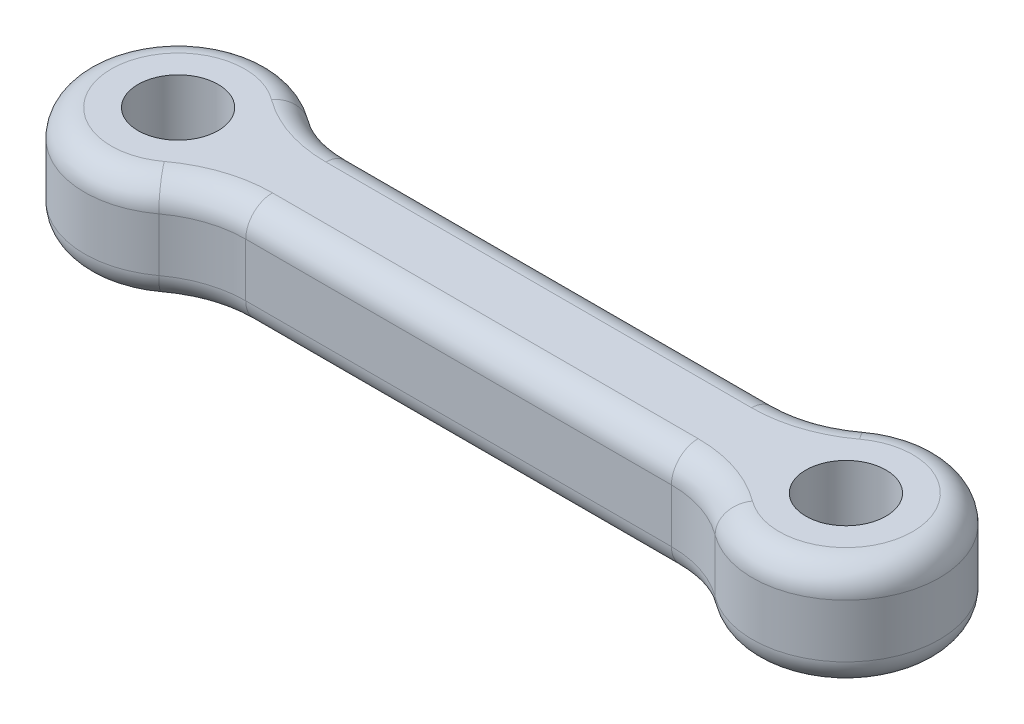
ISO-10303-21;
HEADER;
FILE_DESCRIPTION(('STEP AP214'),'2;1');
FILE_NAME('part.step','',(''),(''),'','','');
FILE_SCHEMA(('AUTOMOTIVE_DESIGN { 1 0 10303 214 1 1 1 1 }'));
ENDSEC;
DATA;
#1=APPLICATION_CONTEXT('core data for automotive mechanical design processes');
#2=APPLICATION_PROTOCOL_DEFINITION('international standard','automotive_design',2000,#1);
#3=PRODUCT_CONTEXT('',#1,'mechanical');
#4=PRODUCT('Part','Part','',(#3));
#5=PRODUCT_RELATED_PRODUCT_CATEGORY('part','',(#4));
#6=PRODUCT_DEFINITION_FORMATION('','',#4);
#7=PRODUCT_DEFINITION_CONTEXT('part definition',#1,'design');
#8=PRODUCT_DEFINITION('design','',#6,#7);
#9=PRODUCT_DEFINITION_SHAPE('','',#8);
#10=(LENGTH_UNIT() NAMED_UNIT(*) SI_UNIT(.MILLI.,.METRE.));
#11=(NAMED_UNIT(*) PLANE_ANGLE_UNIT() SI_UNIT($,.RADIAN.));
#12=(NAMED_UNIT(*) SI_UNIT($,.STERADIAN.) SOLID_ANGLE_UNIT());
#13=UNCERTAINTY_MEASURE_WITH_UNIT(LENGTH_MEASURE(1.E-05),#10,'distance_accuracy_value','');
#14=(GEOMETRIC_REPRESENTATION_CONTEXT(3) GLOBAL_UNCERTAINTY_ASSIGNED_CONTEXT((#13)) GLOBAL_UNIT_ASSIGNED_CONTEXT((#10,
#11,#12)) REPRESENTATION_CONTEXT('',''));
#15=CARTESIAN_POINT('',(0.,0.,0.));
#16=DIRECTION('',(0.,0.,1.));
#17=DIRECTION('',(1.,0.,0.));
#18=AXIS2_PLACEMENT_3D('',#15,#16,#17);
#19=CARTESIAN_POINT('',(4.53284898455871,4.,6.09890663893832));
#20=DIRECTION('',(0.,-1.,0.));
#21=DIRECTION('',(0.,0.,-1.));
#22=AXIS2_PLACEMENT_3D('',#19,#20,#21);
#23=PLANE('',#22);
#24=CARTESIAN_POINT('',(0.,4.,0.));
#25=DIRECTION('',(0.,-1.,0.));
#26=DIRECTION('',(0.,0.,-1.));
#27=AXIS2_PLACEMENT_3D('',#24,#25,#26);
#28=CIRCLE('',#27,2.5);
#29=CARTESIAN_POINT('',(1.49128328585177,4.,-2.00650795197506));
#30=VERTEX_POINT('',#29);
#31=CARTESIAN_POINT('',(1.49128328585177,4.,2.00650795197506));
#32=VERTEX_POINT('',#31);
#33=EDGE_CURVE('E174',#30,#32,#28,.F.);
#34=ORIENTED_EDGE('',*,*,#33,.T.);
#35=CARTESIAN_POINT('',(4.53284898455871,4.,6.09890663893832));
#36=DIRECTION('',(0.,-1.,0.));
#37=DIRECTION('',(0.,0.,-1.));
#38=AXIS2_PLACEMENT_3D('',#35,#36,#37);
#39=CIRCLE('',#38,5.09890663893832);
#40=CARTESIAN_POINT('',(4.53284898455871,4.,1.));
#41=VERTEX_POINT('',#40);
#42=EDGE_CURVE('E155',#32,#41,#39,.T.);
#43=ORIENTED_EDGE('',*,*,#42,.T.);
#44=DIRECTION('',(1.,0.,0.));
#45=VECTOR('',#44,1.);
#46=CARTESIAN_POINT('',(4.53284898455871,4.,1.));
#47=LINE('',#46,#45);
#48=CARTESIAN_POINT('',(20.4671510154413,4.,0.999999999999997));
#49=VERTEX_POINT('',#48);
#50=EDGE_CURVE('E163',#41,#49,#47,.T.);
#51=ORIENTED_EDGE('',*,*,#50,.T.);
#52=CARTESIAN_POINT('',(20.4671510154413,4.,6.09890663893832));
#53=DIRECTION('',(0.,-1.,0.));
#54=DIRECTION('',(0.,0.,-1.));
#55=AXIS2_PLACEMENT_3D('',#52,#53,#54);
#56=CIRCLE('',#55,5.09890663893832);
#57=CARTESIAN_POINT('',(23.5087167141482,4.,2.00650795197506));
#58=VERTEX_POINT('',#57);
#59=EDGE_CURVE('E169',#49,#58,#56,.T.);
#60=ORIENTED_EDGE('',*,*,#59,.T.);
#61=CARTESIAN_POINT('',(25.,4.,0.));
#62=DIRECTION('',(0.,-1.,0.));
#63=DIRECTION('',(0.,0.,-1.));
#64=AXIS2_PLACEMENT_3D('',#61,#62,#63);
#65=CIRCLE('',#64,2.5);
#66=CARTESIAN_POINT('',(23.5087167141482,4.,-2.00650795197506));
#67=VERTEX_POINT('',#66);
#68=EDGE_CURVE('E320',#58,#67,#65,.F.);
#69=ORIENTED_EDGE('',*,*,#68,.T.);
#70=CARTESIAN_POINT('',(20.4671510154413,4.,-6.09890663893832));
#71=DIRECTION('',(0.,-1.,0.));
#72=DIRECTION('',(0.,0.,-1.));
#73=AXIS2_PLACEMENT_3D('',#70,#71,#72);
#74=CIRCLE('',#73,5.09890663893832);
#75=CARTESIAN_POINT('',(20.4671510154413,4.,-1.));
#76=VERTEX_POINT('',#75);
#77=EDGE_CURVE('E322',#67,#76,#74,.T.);
#78=ORIENTED_EDGE('',*,*,#77,.T.);
#79=DIRECTION('',(-1.,0.,0.));
#80=VECTOR('',#79,1.);
#81=CARTESIAN_POINT('',(4.53284898455871,4.,-1.));
#82=LINE('',#81,#80);
#83=CARTESIAN_POINT('',(4.53284898455871,4.,-1.));
#84=VERTEX_POINT('',#83);
#85=EDGE_CURVE('E324',#76,#84,#82,.T.);
#86=ORIENTED_EDGE('',*,*,#85,.T.);
#87=CARTESIAN_POINT('',(4.53284898455871,4.,-6.09890663893832));
#88=DIRECTION('',(0.,-1.,0.));
#89=DIRECTION('',(0.,0.,-1.));
#90=AXIS2_PLACEMENT_3D('',#87,#88,#89);
#91=CIRCLE('',#90,5.09890663893832);
#92=EDGE_CURVE('E180',#84,#30,#91,.T.);
#93=ORIENTED_EDGE('',*,*,#92,.T.);
#94=EDGE_LOOP('',(#34,#43,#51,#60,#69,#78,#86,#93));
#95=FACE_BOUND('',#94,.T.);
#96=CARTESIAN_POINT('',(0.,4.,0.));
#97=DIRECTION('',(0.,1.,0.));
#98=DIRECTION('',(0.,0.,1.));
#99=AXIS2_PLACEMENT_3D('',#96,#97,#98);
#100=CIRCLE('',#99,1.5);
#101=CARTESIAN_POINT('',(0.,4.,1.5));
#102=VERTEX_POINT('',#101);
#103=EDGE_CURVE('E295',#102,#102,#100,.T.);
#104=ORIENTED_EDGE('',*,*,#103,.F.);
#105=EDGE_LOOP('',(#104));
#106=FACE_BOUND('',#105,.T.);
#107=CARTESIAN_POINT('',(25.,4.,0.));
#108=DIRECTION('',(0.,1.,0.));
#109=DIRECTION('',(0.,0.,-1.));
#110=AXIS2_PLACEMENT_3D('',#107,#108,#109);
#111=CIRCLE('',#110,1.5);
#112=CARTESIAN_POINT('',(25.,4.,-1.5));
#113=VERTEX_POINT('',#112);
#114=EDGE_CURVE('E611',#113,#113,#111,.T.);
#115=ORIENTED_EDGE('',*,*,#114,.F.);
#116=EDGE_LOOP('',(#115));
#117=FACE_BOUND('',#116,.T.);
#118=ADVANCED_FACE('F34',(#95,#106,#117),#23,.F.);
#119=CARTESIAN_POINT('',(4.53284898455871,0.,6.09890663893832));
#120=DIRECTION('',(0.,-1.,0.));
#121=DIRECTION('',(0.,0.,-1.));
#122=AXIS2_PLACEMENT_3D('',#119,#120,#121);
#123=PLANE('',#122);
#124=DIRECTION('',(1.,0.,0.));
#125=VECTOR('',#124,1.);
#126=CARTESIAN_POINT('',(4.53284898455871,0.,1.));
#127=LINE('',#126,#125);
#128=CARTESIAN_POINT('',(20.4671510154413,0.,0.999999999999997));
#129=VERTEX_POINT('',#128);
#130=CARTESIAN_POINT('',(4.53284898455871,0.,1.));
#131=VERTEX_POINT('',#130);
#132=EDGE_CURVE('E209',#129,#131,#127,.F.);
#133=ORIENTED_EDGE('',*,*,#132,.T.);
#134=CARTESIAN_POINT('',(4.53284898455871,0.,6.09890663893832));
#135=DIRECTION('',(0.,-1.,0.));
#136=DIRECTION('',(0.,0.,-1.));
#137=AXIS2_PLACEMENT_3D('',#134,#135,#136);
#138=CIRCLE('',#137,5.09890663893832);
#139=CARTESIAN_POINT('',(1.49128328585177,0.,2.00650795197506));
#140=VERTEX_POINT('',#139);
#141=EDGE_CURVE('E222',#131,#140,#138,.F.);
#142=ORIENTED_EDGE('',*,*,#141,.T.);
#143=CARTESIAN_POINT('',(0.,0.,0.));
#144=DIRECTION('',(0.,-1.,0.));
#145=DIRECTION('',(0.,0.,-1.));
#146=AXIS2_PLACEMENT_3D('',#143,#144,#145);
#147=CIRCLE('',#146,2.5);
#148=CARTESIAN_POINT('',(1.49128328585177,0.,-2.00650795197506));
#149=VERTEX_POINT('',#148);
#150=EDGE_CURVE('E58',#140,#149,#147,.T.);
#151=ORIENTED_EDGE('',*,*,#150,.T.);
#152=CARTESIAN_POINT('',(4.53284898455871,0.,-6.09890663893832));
#153=DIRECTION('',(0.,-1.,0.));
#154=DIRECTION('',(0.,0.,-1.));
#155=AXIS2_PLACEMENT_3D('',#152,#153,#154);
#156=CIRCLE('',#155,5.09890663893832);
#157=CARTESIAN_POINT('',(4.53284898455871,0.,-1.));
#158=VERTEX_POINT('',#157);
#159=EDGE_CURVE('E219',#149,#158,#156,.F.);
#160=ORIENTED_EDGE('',*,*,#159,.T.);
#161=DIRECTION('',(-1.,0.,0.));
#162=VECTOR('',#161,1.);
#163=CARTESIAN_POINT('',(20.4671510154413,0.,-1.));
#164=LINE('',#163,#162);
#165=CARTESIAN_POINT('',(20.4671510154413,0.,-1.));
#166=VERTEX_POINT('',#165);
#167=EDGE_CURVE('E217',#158,#166,#164,.F.);
#168=ORIENTED_EDGE('',*,*,#167,.T.);
#169=CARTESIAN_POINT('',(20.4671510154413,0.,-6.09890663893832));
#170=DIRECTION('',(0.,-1.,0.));
#171=DIRECTION('',(0.,0.,-1.));
#172=AXIS2_PLACEMENT_3D('',#169,#170,#171);
#173=CIRCLE('',#172,5.09890663893832);
#174=CARTESIAN_POINT('',(23.5087167141482,0.,-2.00650795197506));
#175=VERTEX_POINT('',#174);
#176=EDGE_CURVE('E215',#166,#175,#173,.F.);
#177=ORIENTED_EDGE('',*,*,#176,.T.);
#178=CARTESIAN_POINT('',(25.,0.,0.));
#179=DIRECTION('',(0.,-1.,0.));
#180=DIRECTION('',(0.,0.,-1.));
#181=AXIS2_PLACEMENT_3D('',#178,#179,#180);
#182=CIRCLE('',#181,2.5);
#183=CARTESIAN_POINT('',(23.5087167141482,0.,2.00650795197506));
#184=VERTEX_POINT('',#183);
#185=EDGE_CURVE('E213',#175,#184,#182,.T.);
#186=ORIENTED_EDGE('',*,*,#185,.T.);
#187=CARTESIAN_POINT('',(20.4671510154413,0.,6.09890663893832));
#188=DIRECTION('',(0.,-1.,0.));
#189=DIRECTION('',(0.,0.,-1.));
#190=AXIS2_PLACEMENT_3D('',#187,#188,#189);
#191=CIRCLE('',#190,5.09890663893832);
#192=EDGE_CURVE('E211',#184,#129,#191,.F.);
#193=ORIENTED_EDGE('',*,*,#192,.T.);
#194=EDGE_LOOP('',(#133,#142,#151,#160,#168,#177,#186,#193));
#195=FACE_BOUND('',#194,.T.);
#196=CARTESIAN_POINT('',(0.,0.,0.));
#197=DIRECTION('',(0.,1.,0.));
#198=DIRECTION('',(0.,0.,1.));
#199=AXIS2_PLACEMENT_3D('',#196,#197,#198);
#200=CIRCLE('',#199,1.5);
#201=CARTESIAN_POINT('',(0.,0.,1.5));
#202=VERTEX_POINT('',#201);
#203=EDGE_CURVE('E300',#202,#202,#200,.T.);
#204=ORIENTED_EDGE('',*,*,#203,.T.);
#205=EDGE_LOOP('',(#204));
#206=FACE_BOUND('',#205,.T.);
#207=CARTESIAN_POINT('',(25.,0.,0.));
#208=DIRECTION('',(0.,1.,0.));
#209=DIRECTION('',(0.,0.,-1.));
#210=AXIS2_PLACEMENT_3D('',#207,#208,#209);
#211=CIRCLE('',#210,1.5);
#212=CARTESIAN_POINT('',(25.,0.,-1.5));
#213=VERTEX_POINT('',#212);
#214=EDGE_CURVE('E242',#213,#213,#211,.T.);
#215=ORIENTED_EDGE('',*,*,#214,.T.);
#216=EDGE_LOOP('',(#215));
#217=FACE_BOUND('',#216,.T.);
#218=ADVANCED_FACE('F273',(#195,#206,#217),#123,.T.);
#219=CARTESIAN_POINT('',(4.53284898455871,4.,6.09890663893832));
#220=DIRECTION('',(0.,-1.,0.));
#221=DIRECTION('',(0.,0.,-1.));
#222=AXIS2_PLACEMENT_3D('',#219,#220,#221);
#223=CYLINDRICAL_SURFACE('',#222,4.09890663893832);
#224=DIRECTION('',(0.,-1.,0.));
#225=VECTOR('',#224,1.);
#226=CARTESIAN_POINT('',(4.53284898455871,4.,2.));
#227=LINE('',#226,#225);
#228=CARTESIAN_POINT('',(4.53284898455871,3.,2.));
#229=VERTEX_POINT('',#228);
#230=CARTESIAN_POINT('',(4.53284898455871,1.,2.));
#231=VERTEX_POINT('',#230);
#232=EDGE_CURVE('E170',#229,#231,#227,.T.);
#233=ORIENTED_EDGE('',*,*,#232,.F.);
#234=CARTESIAN_POINT('',(4.53284898455871,3.,6.09890663893832));
#235=DIRECTION('',(0.,-1.,0.));
#236=DIRECTION('',(0.,0.,-1.));
#237=AXIS2_PLACEMENT_3D('',#234,#235,#236);
#238=CIRCLE('',#237,4.09890663893832);
#239=CARTESIAN_POINT('',(2.08779660019248,3.,2.80911113276508));
#240=VERTEX_POINT('',#239);
#241=EDGE_CURVE('E157',#229,#240,#238,.F.);
#242=ORIENTED_EDGE('',*,*,#241,.T.);
#243=DIRECTION('',(0.,-1.,0.));
#244=VECTOR('',#243,1.);
#245=CARTESIAN_POINT('',(2.08779660019248,4.,2.80911113276508));
#246=LINE('',#245,#244);
#247=CARTESIAN_POINT('',(2.08779660019248,1.,2.80911113276508));
#248=VERTEX_POINT('',#247);
#249=EDGE_CURVE('E288',#240,#248,#246,.T.);
#250=ORIENTED_EDGE('',*,*,#249,.T.);
#251=CARTESIAN_POINT('',(4.53284898455871,1.,6.09890663893832));
#252=DIRECTION('',(0.,-1.,0.));
#253=DIRECTION('',(0.,0.,-1.));
#254=AXIS2_PLACEMENT_3D('',#251,#252,#253);
#255=CIRCLE('',#254,4.09890663893832);
#256=EDGE_CURVE('E176',#248,#231,#255,.T.);
#257=ORIENTED_EDGE('',*,*,#256,.T.);
#258=EDGE_LOOP('',(#233,#242,#250,#257));
#259=FACE_BOUND('',#258,.T.);
#260=ADVANCED_FACE('F293',(#259),#223,.F.);
#261=CARTESIAN_POINT('',(4.53284898455871,4.,2.));
#262=DIRECTION('',(0.,0.,-1.));
#263=DIRECTION('',(-1.,0.,0.));
#264=AXIS2_PLACEMENT_3D('',#261,#262,#263);
#265=PLANE('',#264);
#266=DIRECTION('',(0.,-1.,0.));
#267=VECTOR('',#266,1.);
#268=CARTESIAN_POINT('',(20.4671510154413,4.,2.));
#269=LINE('',#268,#267);
#270=CARTESIAN_POINT('',(20.4671510154413,3.,2.));
#271=VERTEX_POINT('',#270);
#272=CARTESIAN_POINT('',(20.4671510154413,1.,2.));
#273=VERTEX_POINT('',#272);
#274=EDGE_CURVE('E315',#271,#273,#269,.T.);
#275=ORIENTED_EDGE('',*,*,#274,.F.);
#276=DIRECTION('',(1.,0.,0.));
#277=VECTOR('',#276,1.);
#278=CARTESIAN_POINT('',(4.53284898455871,3.,2.));
#279=LINE('',#278,#277);
#280=EDGE_CURVE('E11',#271,#229,#279,.F.);
#281=ORIENTED_EDGE('',*,*,#280,.T.);
#282=ORIENTED_EDGE('',*,*,#232,.T.);
#283=DIRECTION('',(1.,0.,0.));
#284=VECTOR('',#283,1.);
#285=CARTESIAN_POINT('',(20.4671510154413,1.,2.));
#286=LINE('',#285,#284);
#287=EDGE_CURVE('E43',#231,#273,#286,.T.);
#288=ORIENTED_EDGE('',*,*,#287,.T.);
#289=EDGE_LOOP('',(#275,#281,#282,#288));
#290=FACE_BOUND('',#289,.T.);
#291=ADVANCED_FACE('F371',(#290),#265,.F.);
#292=CARTESIAN_POINT('',(20.4671510154413,4.,6.09890663893832));
#293=DIRECTION('',(0.,-1.,0.));
#294=DIRECTION('',(0.,0.,-1.));
#295=AXIS2_PLACEMENT_3D('',#292,#293,#294);
#296=CYLINDRICAL_SURFACE('',#295,4.09890663893832);
#297=DIRECTION('',(0.,-1.,0.));
#298=VECTOR('',#297,1.);
#299=CARTESIAN_POINT('',(22.9122033998075,4.,2.80911113276508));
#300=LINE('',#299,#298);
#301=CARTESIAN_POINT('',(22.9122033998075,3.,2.80911113276508));
#302=VERTEX_POINT('',#301);
#303=CARTESIAN_POINT('',(22.9122033998075,1.,2.80911113276508));
#304=VERTEX_POINT('',#303);
#305=EDGE_CURVE('E312',#302,#304,#300,.T.);
#306=ORIENTED_EDGE('',*,*,#305,.F.);
#307=CARTESIAN_POINT('',(20.4671510154413,3.,6.09890663893832));
#308=DIRECTION('',(0.,-1.,0.));
#309=DIRECTION('',(0.,0.,-1.));
#310=AXIS2_PLACEMENT_3D('',#307,#308,#309);
#311=CIRCLE('',#310,4.09890663893832);
#312=EDGE_CURVE('E207',#302,#271,#311,.F.);
#313=ORIENTED_EDGE('',*,*,#312,.T.);
#314=ORIENTED_EDGE('',*,*,#274,.T.);
#315=CARTESIAN_POINT('',(20.4671510154413,1.,6.09890663893832));
#316=DIRECTION('',(0.,-1.,0.));
#317=DIRECTION('',(0.,0.,-1.));
#318=AXIS2_PLACEMENT_3D('',#315,#316,#317);
#319=CIRCLE('',#318,4.09890663893832);
#320=EDGE_CURVE('E205',#273,#304,#319,.T.);
#321=ORIENTED_EDGE('',*,*,#320,.T.);
#322=EDGE_LOOP('',(#306,#313,#314,#321));
#323=FACE_BOUND('',#322,.T.);
#324=ADVANCED_FACE('F373',(#323),#296,.F.);
#325=CARTESIAN_POINT('',(25.,4.,0.));
#326=DIRECTION('',(0.,-1.,0.));
#327=DIRECTION('',(0.,0.,-1.));
#328=AXIS2_PLACEMENT_3D('',#325,#326,#327);
#329=CYLINDRICAL_SURFACE('',#328,3.5);
#330=DIRECTION('',(0.,-1.,0.));
#331=VECTOR('',#330,1.);
#332=CARTESIAN_POINT('',(22.9122033998075,4.,-2.80911113276508));
#333=LINE('',#332,#331);
#334=CARTESIAN_POINT('',(22.9122033998075,3.,-2.80911113276508));
#335=VERTEX_POINT('',#334);
#336=CARTESIAN_POINT('',(22.9122033998075,1.,-2.80911113276508));
#337=VERTEX_POINT('',#336);
#338=EDGE_CURVE('E309',#335,#337,#333,.T.);
#339=ORIENTED_EDGE('',*,*,#338,.F.);
#340=CARTESIAN_POINT('',(25.,3.,0.));
#341=DIRECTION('',(0.,-1.,0.));
#342=DIRECTION('',(0.,0.,-1.));
#343=AXIS2_PLACEMENT_3D('',#340,#341,#342);
#344=CIRCLE('',#343,3.5);
#345=EDGE_CURVE('E203',#335,#302,#344,.T.);
#346=ORIENTED_EDGE('',*,*,#345,.T.);
#347=ORIENTED_EDGE('',*,*,#305,.T.);
#348=CARTESIAN_POINT('',(25.,1.,0.));
#349=DIRECTION('',(0.,-1.,0.));
#350=DIRECTION('',(0.,0.,-1.));
#351=AXIS2_PLACEMENT_3D('',#348,#349,#350);
#352=CIRCLE('',#351,3.5);
#353=EDGE_CURVE('E201',#304,#337,#352,.F.);
#354=ORIENTED_EDGE('',*,*,#353,.T.);
#355=EDGE_LOOP('',(#339,#346,#347,#354));
#356=FACE_BOUND('',#355,.T.);
#357=ADVANCED_FACE('F355',(#356),#329,.T.);
#358=CARTESIAN_POINT('',(20.4671510154413,4.,-6.09890663893832));
#359=DIRECTION('',(0.,-1.,0.));
#360=DIRECTION('',(0.,0.,-1.));
#361=AXIS2_PLACEMENT_3D('',#358,#359,#360);
#362=CYLINDRICAL_SURFACE('',#361,4.09890663893832);
#363=DIRECTION('',(0.,-1.,0.));
#364=VECTOR('',#363,1.);
#365=CARTESIAN_POINT('',(20.4671510154413,4.,-2.));
#366=LINE('',#365,#364);
#367=CARTESIAN_POINT('',(20.4671510154413,3.,-2.));
#368=VERTEX_POINT('',#367);
#369=CARTESIAN_POINT('',(20.4671510154413,1.,-2.));
#370=VERTEX_POINT('',#369);
#371=EDGE_CURVE('E306',#368,#370,#366,.T.);
#372=ORIENTED_EDGE('',*,*,#371,.F.);
#373=CARTESIAN_POINT('',(20.4671510154413,3.,-6.09890663893832));
#374=DIRECTION('',(0.,-1.,0.));
#375=DIRECTION('',(0.,0.,-1.));
#376=AXIS2_PLACEMENT_3D('',#373,#374,#375);
#377=CIRCLE('',#376,4.09890663893832);
#378=EDGE_CURVE('E199',#368,#335,#377,.F.);
#379=ORIENTED_EDGE('',*,*,#378,.T.);
#380=ORIENTED_EDGE('',*,*,#338,.T.);
#381=CARTESIAN_POINT('',(20.4671510154413,1.,-6.09890663893832));
#382=DIRECTION('',(0.,-1.,0.));
#383=DIRECTION('',(0.,0.,-1.));
#384=AXIS2_PLACEMENT_3D('',#381,#382,#383);
#385=CIRCLE('',#384,4.09890663893832);
#386=EDGE_CURVE('E197',#337,#370,#385,.T.);
#387=ORIENTED_EDGE('',*,*,#386,.T.);
#388=EDGE_LOOP('',(#372,#379,#380,#387));
#389=FACE_BOUND('',#388,.T.);
#390=ADVANCED_FACE('F353',(#389),#362,.F.);
#391=CARTESIAN_POINT('',(4.53284898455871,4.,-2.));
#392=DIRECTION('',(0.,0.,1.));
#393=DIRECTION('',(1.,0.,0.));
#394=AXIS2_PLACEMENT_3D('',#391,#392,#393);
#395=PLANE('',#394);
#396=DIRECTION('',(0.,-1.,0.));
#397=VECTOR('',#396,1.);
#398=CARTESIAN_POINT('',(4.53284898455871,4.,-2.));
#399=LINE('',#398,#397);
#400=CARTESIAN_POINT('',(4.53284898455871,3.,-2.));
#401=VERTEX_POINT('',#400);
#402=CARTESIAN_POINT('',(4.53284898455871,1.,-2.));
#403=VERTEX_POINT('',#402);
#404=EDGE_CURVE('E297',#401,#403,#399,.T.);
#405=ORIENTED_EDGE('',*,*,#404,.F.);
#406=DIRECTION('',(-1.,0.,0.));
#407=VECTOR('',#406,1.);
#408=CARTESIAN_POINT('',(4.53284898455871,3.,-2.));
#409=LINE('',#408,#407);
#410=EDGE_CURVE('E195',#401,#368,#409,.F.);
#411=ORIENTED_EDGE('',*,*,#410,.T.);
#412=ORIENTED_EDGE('',*,*,#371,.T.);
#413=DIRECTION('',(-1.,0.,0.));
#414=VECTOR('',#413,1.);
#415=CARTESIAN_POINT('',(4.53284898455871,1.,-2.));
#416=LINE('',#415,#414);
#417=EDGE_CURVE('E193',#370,#403,#416,.T.);
#418=ORIENTED_EDGE('',*,*,#417,.T.);
#419=EDGE_LOOP('',(#405,#411,#412,#418));
#420=FACE_BOUND('',#419,.T.);
#421=ADVANCED_FACE('F340',(#420),#395,.F.);
#422=CARTESIAN_POINT('',(4.53284898455871,4.,-6.09890663893832));
#423=DIRECTION('',(0.,-1.,0.));
#424=DIRECTION('',(0.,0.,-1.));
#425=AXIS2_PLACEMENT_3D('',#422,#423,#424);
#426=CYLINDRICAL_SURFACE('',#425,4.09890663893832);
#427=DIRECTION('',(0.,-1.,0.));
#428=VECTOR('',#427,1.);
#429=CARTESIAN_POINT('',(2.08779660019248,4.,-2.80911113276508));
#430=LINE('',#429,#428);
#431=CARTESIAN_POINT('',(2.08779660019248,3.,-2.80911113276508));
#432=VERTEX_POINT('',#431);
#433=CARTESIAN_POINT('',(2.08779660019248,1.,-2.80911113276508));
#434=VERTEX_POINT('',#433);
#435=EDGE_CURVE('E290',#432,#434,#430,.T.);
#436=ORIENTED_EDGE('',*,*,#435,.F.);
#437=CARTESIAN_POINT('',(4.53284898455871,3.,-6.09890663893832));
#438=DIRECTION('',(0.,-1.,0.));
#439=DIRECTION('',(0.,0.,-1.));
#440=AXIS2_PLACEMENT_3D('',#437,#438,#439);
#441=CIRCLE('',#440,4.09890663893832);
#442=EDGE_CURVE('E191',#432,#401,#441,.F.);
#443=ORIENTED_EDGE('',*,*,#442,.T.);
#444=ORIENTED_EDGE('',*,*,#404,.T.);
#445=CARTESIAN_POINT('',(4.53284898455871,1.,-6.09890663893832));
#446=DIRECTION('',(0.,-1.,0.));
#447=DIRECTION('',(0.,0.,-1.));
#448=AXIS2_PLACEMENT_3D('',#445,#446,#447);
#449=CIRCLE('',#448,4.09890663893832);
#450=EDGE_CURVE('E189',#403,#434,#449,.T.);
#451=ORIENTED_EDGE('',*,*,#450,.T.);
#452=EDGE_LOOP('',(#436,#443,#444,#451));
#453=FACE_BOUND('',#452,.T.);
#454=ADVANCED_FACE('F336',(#453),#426,.F.);
#455=CARTESIAN_POINT('',(0.,4.,0.));
#456=DIRECTION('',(0.,-1.,0.));
#457=DIRECTION('',(0.,0.,-1.));
#458=AXIS2_PLACEMENT_3D('',#455,#456,#457);
#459=CYLINDRICAL_SURFACE('',#458,3.5);
#460=ORIENTED_EDGE('',*,*,#249,.F.);
#461=CARTESIAN_POINT('',(0.,3.,0.));
#462=DIRECTION('',(0.,-1.,0.));
#463=DIRECTION('',(0.,0.,-1.));
#464=AXIS2_PLACEMENT_3D('',#461,#462,#463);
#465=CIRCLE('',#464,3.5);
#466=EDGE_CURVE('E187',#240,#432,#465,.T.);
#467=ORIENTED_EDGE('',*,*,#466,.T.);
#468=ORIENTED_EDGE('',*,*,#435,.T.);
#469=CARTESIAN_POINT('',(0.,1.,0.));
#470=DIRECTION('',(0.,-1.,0.));
#471=DIRECTION('',(0.,0.,-1.));
#472=AXIS2_PLACEMENT_3D('',#469,#470,#471);
#473=CIRCLE('',#472,3.5);
#474=EDGE_CURVE('E185',#434,#248,#473,.F.);
#475=ORIENTED_EDGE('',*,*,#474,.T.);
#476=EDGE_LOOP('',(#460,#467,#468,#475));
#477=FACE_BOUND('',#476,.T.);
#478=ADVANCED_FACE('F287',(#477),#459,.T.);
#479=CARTESIAN_POINT('',(0.,4.,0.));
#480=DIRECTION('',(0.,-1.,0.));
#481=DIRECTION('',(0.,0.,-1.));
#482=AXIS2_PLACEMENT_3D('',#479,#480,#481);
#483=CYLINDRICAL_SURFACE('',#482,1.5);
#484=ORIENTED_EDGE('',*,*,#103,.T.);
#485=EDGE_LOOP('',(#484));
#486=FACE_BOUND('',#485,.T.);
#487=ORIENTED_EDGE('',*,*,#203,.F.);
#488=EDGE_LOOP('',(#487));
#489=FACE_BOUND('',#488,.T.);
#490=ADVANCED_FACE('F396',(#486,#489),#483,.F.);
#491=CARTESIAN_POINT('',(25.,4.,0.));
#492=DIRECTION('',(0.,-1.,0.));
#493=DIRECTION('',(0.,0.,-1.));
#494=AXIS2_PLACEMENT_3D('',#491,#492,#493);
#495=CYLINDRICAL_SURFACE('',#494,1.5);
#496=ORIENTED_EDGE('',*,*,#114,.T.);
#497=EDGE_LOOP('',(#496));
#498=FACE_BOUND('',#497,.T.);
#499=ORIENTED_EDGE('',*,*,#214,.F.);
#500=EDGE_LOOP('',(#499));
#501=FACE_BOUND('',#500,.T.);
#502=ADVANCED_FACE('F529',(#498,#501),#495,.F.);
#503=CARTESIAN_POINT('',(20.4671510154413,3.,-6.09890663893832));
#504=DIRECTION('',(0.,-1.,0.));
#505=DIRECTION('',(0.,0.,-1.));
#506=AXIS2_PLACEMENT_3D('',#503,#504,#505);
#507=TOROIDAL_SURFACE('',#506,5.09890663893832,1.);
#508=CARTESIAN_POINT('',(23.5087167141482,3.,-2.00650795197506));
#509=DIRECTION('',(0.802603180790023,0.,-0.596513314340709));
#510=DIRECTION('',(-0.596513314340709,0.,-0.802603180790023));
#511=AXIS2_PLACEMENT_3D('',#508,#509,#510);
#512=CIRCLE('',#511,1.);
#513=EDGE_CURVE('E236',#335,#67,#512,.T.);
#514=ORIENTED_EDGE('',*,*,#513,.F.);
#515=ORIENTED_EDGE('',*,*,#378,.F.);
#516=CARTESIAN_POINT('',(20.4671510154413,3.,-1.));
#517=DIRECTION('',(-1.,0.,0.));
#518=DIRECTION('',(0.,0.,1.));
#519=AXIS2_PLACEMENT_3D('',#516,#517,#518);
#520=CIRCLE('',#519,1.);
#521=EDGE_CURVE('E239',#76,#368,#520,.T.);
#522=ORIENTED_EDGE('',*,*,#521,.F.);
#523=ORIENTED_EDGE('',*,*,#77,.F.);
#524=EDGE_LOOP('',(#514,#515,#522,#523));
#525=FACE_BOUND('',#524,.T.);
#526=ADVANCED_FACE('F349',(#525),#507,.T.);
#527=CARTESIAN_POINT('',(4.53284898455871,3.,-1.));
#528=DIRECTION('',(-1.,0.,0.));
#529=DIRECTION('',(0.,0.,1.));
#530=AXIS2_PLACEMENT_3D('',#527,#528,#529);
#531=CYLINDRICAL_SURFACE('',#530,1.);
#532=ORIENTED_EDGE('',*,*,#521,.T.);
#533=ORIENTED_EDGE('',*,*,#410,.F.);
#534=CARTESIAN_POINT('',(4.53284898455871,3.,-1.));
#535=DIRECTION('',(-1.,0.,0.));
#536=DIRECTION('',(0.,0.,1.));
#537=AXIS2_PLACEMENT_3D('',#534,#535,#536);
#538=CIRCLE('',#537,1.);
#539=EDGE_CURVE('E233',#84,#401,#538,.T.);
#540=ORIENTED_EDGE('',*,*,#539,.F.);
#541=ORIENTED_EDGE('',*,*,#85,.F.);
#542=EDGE_LOOP('',(#532,#533,#540,#541));
#543=FACE_BOUND('',#542,.T.);
#544=ADVANCED_FACE('F343',(#543),#531,.T.);
#545=CARTESIAN_POINT('',(25.,3.,0.));
#546=DIRECTION('',(0.,-1.,0.));
#547=DIRECTION('',(0.,0.,-1.));
#548=AXIS2_PLACEMENT_3D('',#545,#546,#547);
#549=TOROIDAL_SURFACE('',#548,2.5,1.);
#550=ORIENTED_EDGE('',*,*,#513,.T.);
#551=ORIENTED_EDGE('',*,*,#68,.F.);
#552=CARTESIAN_POINT('',(23.5087167141482,3.,2.00650795197505));
#553=DIRECTION('',(-0.802603180790023,0.,-0.596513314340709));
#554=DIRECTION('',(-0.59651331434071,0.,0.802603180790023));
#555=AXIS2_PLACEMENT_3D('',#552,#553,#554);
#556=CIRCLE('',#555,1.);
#557=EDGE_CURVE('E230',#302,#58,#556,.T.);
#558=ORIENTED_EDGE('',*,*,#557,.F.);
#559=ORIENTED_EDGE('',*,*,#345,.F.);
#560=EDGE_LOOP('',(#550,#551,#558,#559));
#561=FACE_BOUND('',#560,.T.);
#562=ADVANCED_FACE('F380',(#561),#549,.T.);
#563=CARTESIAN_POINT('',(4.53284898455871,3.,-6.09890663893832));
#564=DIRECTION('',(0.,-1.,0.));
#565=DIRECTION('',(0.,0.,-1.));
#566=AXIS2_PLACEMENT_3D('',#563,#564,#565);
#567=TOROIDAL_SURFACE('',#566,5.09890663893832,1.);
#568=ORIENTED_EDGE('',*,*,#539,.T.);
#569=ORIENTED_EDGE('',*,*,#442,.F.);
#570=CARTESIAN_POINT('',(1.49128328585177,3.,-2.00650795197506));
#571=DIRECTION('',(-0.802603180790023,0.,-0.596513314340709));
#572=DIRECTION('',(-0.596513314340709,0.,0.802603180790023));
#573=AXIS2_PLACEMENT_3D('',#570,#571,#572);
#574=CIRCLE('',#573,1.);
#575=EDGE_CURVE('E227',#30,#432,#574,.T.);
#576=ORIENTED_EDGE('',*,*,#575,.F.);
#577=ORIENTED_EDGE('',*,*,#92,.F.);
#578=EDGE_LOOP('',(#568,#569,#576,#577));
#579=FACE_BOUND('',#578,.T.);
#580=ADVANCED_FACE('F331',(#579),#567,.T.);
#581=CARTESIAN_POINT('',(20.4671510154413,3.,6.09890663893832));
#582=DIRECTION('',(0.,-1.,0.));
#583=DIRECTION('',(0.,0.,-1.));
#584=AXIS2_PLACEMENT_3D('',#581,#582,#583);
#585=TOROIDAL_SURFACE('',#584,5.09890663893832,1.);
#586=ORIENTED_EDGE('',*,*,#557,.T.);
#587=ORIENTED_EDGE('',*,*,#59,.F.);
#588=CARTESIAN_POINT('',(20.4671510154413,3.,0.999999999999996));
#589=DIRECTION('',(-1.,0.,0.));
#590=DIRECTION('',(0.,0.,1.));
#591=AXIS2_PLACEMENT_3D('',#588,#589,#590);
#592=CIRCLE('',#591,1.);
#593=EDGE_CURVE('E166',#271,#49,#592,.T.);
#594=ORIENTED_EDGE('',*,*,#593,.F.);
#595=ORIENTED_EDGE('',*,*,#312,.F.);
#596=EDGE_LOOP('',(#586,#587,#594,#595));
#597=FACE_BOUND('',#596,.T.);
#598=ADVANCED_FACE('F377',(#597),#585,.T.);
#599=CARTESIAN_POINT('',(0.,3.,0.));
#600=DIRECTION('',(0.,-1.,0.));
#601=DIRECTION('',(0.,0.,-1.));
#602=AXIS2_PLACEMENT_3D('',#599,#600,#601);
#603=TOROIDAL_SURFACE('',#602,2.5,1.);
#604=ORIENTED_EDGE('',*,*,#575,.T.);
#605=ORIENTED_EDGE('',*,*,#466,.F.);
#606=CARTESIAN_POINT('',(1.49128328585177,3.,2.00650795197506));
#607=DIRECTION('',(0.802603180790023,0.,-0.596513314340709));
#608=DIRECTION('',(-0.596513314340709,0.,-0.802603180790023));
#609=AXIS2_PLACEMENT_3D('',#606,#607,#608);
#610=CIRCLE('',#609,1.);
#611=EDGE_CURVE('E160',#32,#240,#610,.T.);
#612=ORIENTED_EDGE('',*,*,#611,.F.);
#613=ORIENTED_EDGE('',*,*,#33,.F.);
#614=EDGE_LOOP('',(#604,#605,#612,#613));
#615=FACE_BOUND('',#614,.T.);
#616=ADVANCED_FACE('F334',(#615),#603,.T.);
#617=CARTESIAN_POINT('',(4.53284898455871,3.,1.));
#618=DIRECTION('',(1.,0.,0.));
#619=DIRECTION('',(0.,0.,-1.));
#620=AXIS2_PLACEMENT_3D('',#617,#618,#619);
#621=CYLINDRICAL_SURFACE('',#620,1.);
#622=ORIENTED_EDGE('',*,*,#593,.T.);
#623=ORIENTED_EDGE('',*,*,#50,.F.);
#624=CARTESIAN_POINT('',(4.53284898455871,3.,1.));
#625=DIRECTION('',(-1.,0.,0.));
#626=DIRECTION('',(0.,0.,1.));
#627=AXIS2_PLACEMENT_3D('',#624,#625,#626);
#628=CIRCLE('',#627,1.);
#629=EDGE_CURVE('E151',#229,#41,#628,.T.);
#630=ORIENTED_EDGE('',*,*,#629,.F.);
#631=ORIENTED_EDGE('',*,*,#280,.F.);
#632=EDGE_LOOP('',(#622,#623,#630,#631));
#633=FACE_BOUND('',#632,.T.);
#634=ADVANCED_FACE('F164',(#633),#621,.T.);
#635=CARTESIAN_POINT('',(4.53284898455871,3.,6.09890663893832));
#636=DIRECTION('',(0.,-1.,0.));
#637=DIRECTION('',(0.,0.,-1.));
#638=AXIS2_PLACEMENT_3D('',#635,#636,#637);
#639=TOROIDAL_SURFACE('',#638,5.09890663893832,1.);
#640=ORIENTED_EDGE('',*,*,#611,.T.);
#641=ORIENTED_EDGE('',*,*,#241,.F.);
#642=ORIENTED_EDGE('',*,*,#629,.T.);
#643=ORIENTED_EDGE('',*,*,#42,.F.);
#644=EDGE_LOOP('',(#640,#641,#642,#643));
#645=FACE_BOUND('',#644,.T.);
#646=ADVANCED_FACE('F153',(#645),#639,.T.);
#647=CARTESIAN_POINT('',(20.4671510154413,1.,-6.09890663893832));
#648=DIRECTION('',(0.,-1.,0.));
#649=DIRECTION('',(0.,0.,-1.));
#650=AXIS2_PLACEMENT_3D('',#647,#648,#649);
#651=TOROIDAL_SURFACE('',#650,5.09890663893832,1.);
#652=CARTESIAN_POINT('',(23.5087167141482,1.,-2.00650795197506));
#653=DIRECTION('',(0.802603180790023,0.,-0.59651331434071));
#654=DIRECTION('',(-0.59651331434071,0.,-0.802603180790023));
#655=AXIS2_PLACEMENT_3D('',#652,#653,#654);
#656=CIRCLE('',#655,1.);
#657=EDGE_CURVE('E257',#175,#337,#656,.T.);
#658=ORIENTED_EDGE('',*,*,#657,.F.);
#659=ORIENTED_EDGE('',*,*,#176,.F.);
#660=CARTESIAN_POINT('',(20.4671510154413,1.,-1.));
#661=DIRECTION('',(-1.,0.,0.));
#662=DIRECTION('',(0.,0.,1.));
#663=AXIS2_PLACEMENT_3D('',#660,#661,#662);
#664=CIRCLE('',#663,1.);
#665=EDGE_CURVE('E38',#370,#166,#664,.T.);
#666=ORIENTED_EDGE('',*,*,#665,.F.);
#667=ORIENTED_EDGE('',*,*,#386,.F.);
#668=EDGE_LOOP('',(#658,#659,#666,#667));
#669=FACE_BOUND('',#668,.T.);
#670=ADVANCED_FACE('F36',(#669),#651,.T.);
#671=CARTESIAN_POINT('',(4.53284898455871,1.,-1.));
#672=DIRECTION('',(1.,0.,0.));
#673=DIRECTION('',(0.,0.,-1.));
#674=AXIS2_PLACEMENT_3D('',#671,#672,#673);
#675=CYLINDRICAL_SURFACE('',#674,1.);
#676=ORIENTED_EDGE('',*,*,#665,.T.);
#677=ORIENTED_EDGE('',*,*,#167,.F.);
#678=CARTESIAN_POINT('',(4.53284898455871,1.,-1.));
#679=DIRECTION('',(-1.,0.,0.));
#680=DIRECTION('',(0.,0.,1.));
#681=AXIS2_PLACEMENT_3D('',#678,#679,#680);
#682=CIRCLE('',#681,1.);
#683=EDGE_CURVE('E255',#403,#158,#682,.T.);
#684=ORIENTED_EDGE('',*,*,#683,.F.);
#685=ORIENTED_EDGE('',*,*,#417,.F.);
#686=EDGE_LOOP('',(#676,#677,#684,#685));
#687=FACE_BOUND('',#686,.T.);
#688=ADVANCED_FACE('F268',(#687),#675,.T.);
#689=CARTESIAN_POINT('',(25.,1.,0.));
#690=DIRECTION('',(0.,-1.,0.));
#691=DIRECTION('',(0.,0.,-1.));
#692=AXIS2_PLACEMENT_3D('',#689,#690,#691);
#693=TOROIDAL_SURFACE('',#692,2.5,1.);
#694=ORIENTED_EDGE('',*,*,#657,.T.);
#695=ORIENTED_EDGE('',*,*,#353,.F.);
#696=CARTESIAN_POINT('',(23.5087167141482,1.,2.00650795197505));
#697=DIRECTION('',(-0.802603180790023,0.,-0.596513314340709));
#698=DIRECTION('',(-0.59651331434071,0.,0.802603180790023));
#699=AXIS2_PLACEMENT_3D('',#696,#697,#698);
#700=CIRCLE('',#699,1.);
#701=EDGE_CURVE('E252',#184,#304,#700,.T.);
#702=ORIENTED_EDGE('',*,*,#701,.F.);
#703=ORIENTED_EDGE('',*,*,#185,.F.);
#704=EDGE_LOOP('',(#694,#695,#702,#703));
#705=FACE_BOUND('',#704,.T.);
#706=ADVANCED_FACE('F357',(#705),#693,.T.);
#707=CARTESIAN_POINT('',(4.53284898455871,1.,-6.09890663893832));
#708=DIRECTION('',(0.,-1.,0.));
#709=DIRECTION('',(0.,0.,-1.));
#710=AXIS2_PLACEMENT_3D('',#707,#708,#709);
#711=TOROIDAL_SURFACE('',#710,5.09890663893832,1.);
#712=ORIENTED_EDGE('',*,*,#683,.T.);
#713=ORIENTED_EDGE('',*,*,#159,.F.);
#714=CARTESIAN_POINT('',(1.49128328585177,1.,-2.00650795197506));
#715=DIRECTION('',(-0.802603180790023,0.,-0.596513314340709));
#716=DIRECTION('',(-0.596513314340709,0.,0.802603180790023));
#717=AXIS2_PLACEMENT_3D('',#714,#715,#716);
#718=CIRCLE('',#717,1.);
#719=EDGE_CURVE('E249',#434,#149,#718,.T.);
#720=ORIENTED_EDGE('',*,*,#719,.F.);
#721=ORIENTED_EDGE('',*,*,#450,.F.);
#722=EDGE_LOOP('',(#712,#713,#720,#721));
#723=FACE_BOUND('',#722,.T.);
#724=ADVANCED_FACE('F278',(#723),#711,.T.);
#725=CARTESIAN_POINT('',(20.4671510154413,1.,6.09890663893832));
#726=DIRECTION('',(0.,-1.,0.));
#727=DIRECTION('',(0.,0.,-1.));
#728=AXIS2_PLACEMENT_3D('',#725,#726,#727);
#729=TOROIDAL_SURFACE('',#728,5.09890663893832,1.);
#730=ORIENTED_EDGE('',*,*,#701,.T.);
#731=ORIENTED_EDGE('',*,*,#320,.F.);
#732=CARTESIAN_POINT('',(20.4671510154413,1.,0.999999999999996));
#733=DIRECTION('',(-1.,0.,0.));
#734=DIRECTION('',(0.,0.,1.));
#735=AXIS2_PLACEMENT_3D('',#732,#733,#734);
#736=CIRCLE('',#735,1.);
#737=EDGE_CURVE('E246',#129,#273,#736,.T.);
#738=ORIENTED_EDGE('',*,*,#737,.F.);
#739=ORIENTED_EDGE('',*,*,#192,.F.);
#740=EDGE_LOOP('',(#730,#731,#738,#739));
#741=FACE_BOUND('',#740,.T.);
#742=ADVANCED_FACE('F361',(#741),#729,.T.);
#743=CARTESIAN_POINT('',(0.,1.,0.));
#744=DIRECTION('',(0.,-1.,0.));
#745=DIRECTION('',(0.,0.,-1.));
#746=AXIS2_PLACEMENT_3D('',#743,#744,#745);
#747=TOROIDAL_SURFACE('',#746,2.5,1.);
#748=ORIENTED_EDGE('',*,*,#719,.T.);
#749=ORIENTED_EDGE('',*,*,#150,.F.);
#750=CARTESIAN_POINT('',(1.49128328585177,1.,2.00650795197506));
#751=DIRECTION('',(0.802603180790023,0.,-0.596513314340709));
#752=DIRECTION('',(-0.596513314340709,0.,-0.802603180790023));
#753=AXIS2_PLACEMENT_3D('',#750,#751,#752);
#754=CIRCLE('',#753,1.);
#755=EDGE_CURVE('E51',#248,#140,#754,.T.);
#756=ORIENTED_EDGE('',*,*,#755,.F.);
#757=ORIENTED_EDGE('',*,*,#474,.F.);
#758=EDGE_LOOP('',(#748,#749,#756,#757));
#759=FACE_BOUND('',#758,.T.);
#760=ADVANCED_FACE('F282',(#759),#747,.T.);
#761=CARTESIAN_POINT('',(4.53284898455871,1.,1.));
#762=DIRECTION('',(-1.,0.,0.));
#763=DIRECTION('',(0.,0.,1.));
#764=AXIS2_PLACEMENT_3D('',#761,#762,#763);
#765=CYLINDRICAL_SURFACE('',#764,1.);
#766=ORIENTED_EDGE('',*,*,#737,.T.);
#767=ORIENTED_EDGE('',*,*,#287,.F.);
#768=CARTESIAN_POINT('',(4.53284898455871,1.,1.));
#769=DIRECTION('',(-1.,0.,0.));
#770=DIRECTION('',(0.,0.,1.));
#771=AXIS2_PLACEMENT_3D('',#768,#769,#770);
#772=CIRCLE('',#771,1.);
#773=EDGE_CURVE('E243',#131,#231,#772,.T.);
#774=ORIENTED_EDGE('',*,*,#773,.F.);
#775=ORIENTED_EDGE('',*,*,#132,.F.);
#776=EDGE_LOOP('',(#766,#767,#774,#775));
#777=FACE_BOUND('',#776,.T.);
#778=ADVANCED_FACE('F368',(#777),#765,.T.);
#779=CARTESIAN_POINT('',(4.53284898455871,1.,6.09890663893832));
#780=DIRECTION('',(0.,-1.,0.));
#781=DIRECTION('',(0.,0.,-1.));
#782=AXIS2_PLACEMENT_3D('',#779,#780,#781);
#783=TOROIDAL_SURFACE('',#782,5.09890663893832,1.);
#784=ORIENTED_EDGE('',*,*,#755,.T.);
#785=ORIENTED_EDGE('',*,*,#141,.F.);
#786=ORIENTED_EDGE('',*,*,#773,.T.);
#787=ORIENTED_EDGE('',*,*,#256,.F.);
#788=EDGE_LOOP('',(#784,#785,#786,#787));
#789=FACE_BOUND('',#788,.T.);
#790=ADVANCED_FACE('F366',(#789),#783,.T.);
#791=CLOSED_SHELL('',(#118,#218,#260,#291,#324,#357,#390,#421,#454,#478,#490,#502,#526,#544,
#562,#580,#598,#616,#634,#646,#670,#688,#706,#724,#742,#760,#778,#790));
#792=MANIFOLD_SOLID_BREP('B2',#791);
#793=ADVANCED_BREP_SHAPE_REPRESENTATION('',(#18,#792),#14);
#794=SHAPE_DEFINITION_REPRESENTATION(#9,#793);
ENDSEC;
END-ISO-10303-21;
